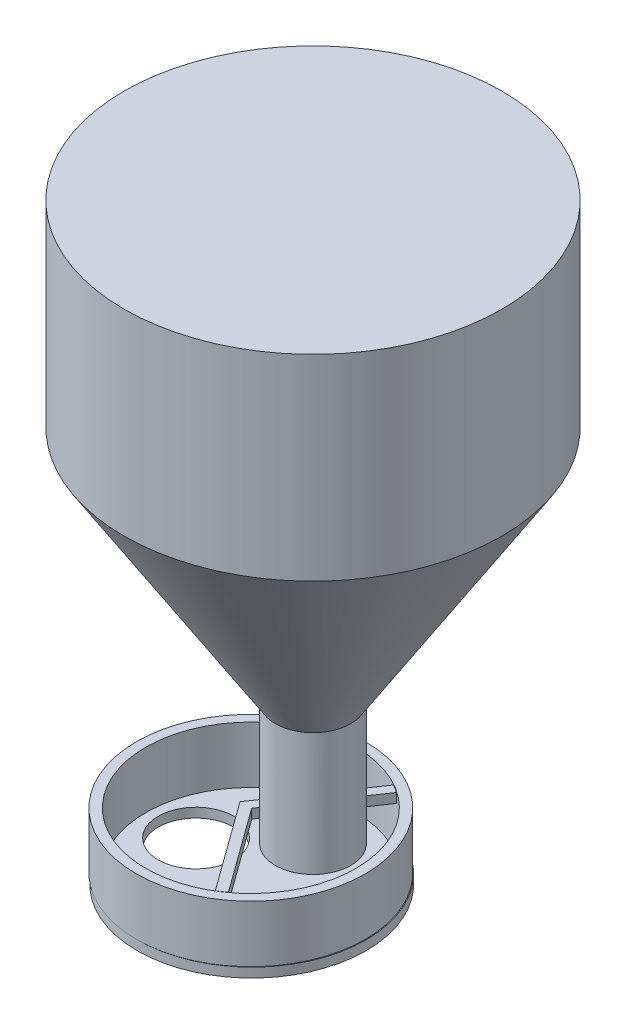
ISO-10303-21;
HEADER;
FILE_DESCRIPTION(('STEP AP214'),'2;1');
FILE_NAME('part.step','',(''),(''),'','','');
FILE_SCHEMA(('AUTOMOTIVE_DESIGN { 1 0 10303 214 1 1 1 1 }'));
ENDSEC;
DATA;
#1=APPLICATION_CONTEXT('core data for automotive mechanical design processes');
#2=APPLICATION_PROTOCOL_DEFINITION('international standard','automotive_design',2000,#1);
#3=PRODUCT_CONTEXT('',#1,'mechanical');
#4=PRODUCT('Part','Part','',(#3));
#5=PRODUCT_RELATED_PRODUCT_CATEGORY('part','',(#4));
#6=PRODUCT_DEFINITION_FORMATION('','',#4);
#7=PRODUCT_DEFINITION_CONTEXT('part definition',#1,'design');
#8=PRODUCT_DEFINITION('design','',#6,#7);
#9=PRODUCT_DEFINITION_SHAPE('','',#8);
#10=(LENGTH_UNIT() NAMED_UNIT(*) SI_UNIT(.MILLI.,.METRE.));
#11=(NAMED_UNIT(*) PLANE_ANGLE_UNIT() SI_UNIT($,.RADIAN.));
#12=(NAMED_UNIT(*) SI_UNIT($,.STERADIAN.) SOLID_ANGLE_UNIT());
#13=UNCERTAINTY_MEASURE_WITH_UNIT(LENGTH_MEASURE(1.E-05),#10,'distance_accuracy_value','');
#14=(GEOMETRIC_REPRESENTATION_CONTEXT(3) GLOBAL_UNCERTAINTY_ASSIGNED_CONTEXT((#13)) GLOBAL_UNIT_ASSIGNED_CONTEXT((#10,
#11,#12)) REPRESENTATION_CONTEXT('',''));
#15=CARTESIAN_POINT('',(0.,0.,0.));
#16=DIRECTION('',(0.,0.,1.));
#17=DIRECTION('',(1.,0.,0.));
#18=AXIS2_PLACEMENT_3D('',#15,#16,#17);
#19=CARTESIAN_POINT('',(-32.4436156280203,-300.,0.));
#20=DIRECTION('',(0.82602679065227,0.,0.563630855369639));
#21=DIRECTION('',(0.563630855369639,0.,-0.82602679065227));
#22=AXIS2_PLACEMENT_3D('',#19,#20,#21);
#23=PLANE('',#22);
#24=DIRECTION('',(0.563630855369639,0.,-0.82602679065227));
#25=VECTOR('',#24,1.);
#26=CARTESIAN_POINT('',(-32.4436156280203,-295.,0.));
#27=LINE('',#26,#25);
#28=CARTESIAN_POINT('',(-32.4436156280203,-295.,0.));
#29=VERTEX_POINT('',#28);
#30=CARTESIAN_POINT('',(-1.35770212525713,-295.,-45.5578276465039));
#31=VERTEX_POINT('',#30);
#32=EDGE_CURVE('E133',#29,#31,#27,.T.);
#33=ORIENTED_EDGE('',*,*,#32,.F.);
#34=DIRECTION('',(0.,1.,0.));
#35=VECTOR('',#34,1.);
#36=CARTESIAN_POINT('',(-32.4436156280203,-300.,0.));
#37=LINE('',#36,#35);
#38=CARTESIAN_POINT('',(-32.4436156280203,-300.,0.));
#39=VERTEX_POINT('',#38);
#40=EDGE_CURVE('E13',#39,#29,#37,.T.);
#41=ORIENTED_EDGE('',*,*,#40,.F.);
#42=DIRECTION('',(0.563630855369639,0.,-0.82602679065227));
#43=VECTOR('',#42,1.);
#44=CARTESIAN_POINT('',(-32.4436156280203,-300.,0.));
#45=LINE('',#44,#43);
#46=CARTESIAN_POINT('',(-1.35770212525713,-300.,-45.5578276465039));
#47=VERTEX_POINT('',#46);
#48=EDGE_CURVE('E147',#39,#47,#45,.T.);
#49=ORIENTED_EDGE('',*,*,#48,.T.);
#50=DIRECTION('',(0.,1.,0.));
#51=VECTOR('',#50,1.);
#52=CARTESIAN_POINT('',(-1.35770212525713,-300.,-45.5578276465039));
#53=LINE('',#52,#51);
#54=EDGE_CURVE('E51',#47,#31,#53,.T.);
#55=ORIENTED_EDGE('',*,*,#54,.T.);
#56=EDGE_LOOP('',(#33,#41,#49,#55));
#57=FACE_BOUND('',#56,.T.);
#58=ADVANCED_FACE('F48',(#57),#23,.T.);
#59=CARTESIAN_POINT('',(-0.108415749461369,-300.,44.6797999881767));
#60=DIRECTION('',(0.810106927783927,0.,-0.586282155243094));
#61=DIRECTION('',(-0.586282155243094,0.,-0.810106927783927));
#62=AXIS2_PLACEMENT_3D('',#59,#60,#61);
#63=PLANE('',#62);
#64=DIRECTION('',(-0.586282155243094,0.,-0.810106927783927));
#65=VECTOR('',#64,1.);
#66=CARTESIAN_POINT('',(-0.108415749461369,-295.,44.6797999881767));
#67=LINE('',#66,#65);
#68=CARTESIAN_POINT('',(-0.108415749461369,-295.,44.6797999881767));
#69=VERTEX_POINT('',#68);
#70=EDGE_CURVE('E145',#69,#29,#67,.T.);
#71=ORIENTED_EDGE('',*,*,#70,.F.);
#72=DIRECTION('',(0.,1.,0.));
#73=VECTOR('',#72,1.);
#74=CARTESIAN_POINT('',(-0.108415749461369,-300.,44.6797999881767));
#75=LINE('',#74,#73);
#76=CARTESIAN_POINT('',(-0.108415749461369,-300.,44.6797999881767));
#77=VERTEX_POINT('',#76);
#78=EDGE_CURVE('E57',#77,#69,#75,.T.);
#79=ORIENTED_EDGE('',*,*,#78,.F.);
#80=DIRECTION('',(-0.586282155243094,0.,-0.810106927783927));
#81=VECTOR('',#80,1.);
#82=CARTESIAN_POINT('',(-0.108415749461369,-300.,44.6797999881767));
#83=LINE('',#82,#81);
#84=EDGE_CURVE('E123',#77,#39,#83,.T.);
#85=ORIENTED_EDGE('',*,*,#84,.T.);
#86=ORIENTED_EDGE('',*,*,#40,.T.);
#87=EDGE_LOOP('',(#71,#79,#85,#86));
#88=FACE_BOUND('',#87,.T.);
#89=ADVANCED_FACE('F155',(#88),#63,.T.);
#90=CARTESIAN_POINT('',(-32.4436156280203,-300.,0.));
#91=DIRECTION('',(0.,1.,0.));
#92=DIRECTION('',(0.,0.,1.));
#93=AXIS2_PLACEMENT_3D('',#90,#91,#92);
#94=CYLINDRICAL_SURFACE('',#93,55.1529661774399);
#95=CARTESIAN_POINT('',(-32.4436156280203,-295.,0.));
#96=DIRECTION('',(0.,1.,0.));
#97=DIRECTION('',(0.,0.,1.));
#98=AXIS2_PLACEMENT_3D('',#95,#96,#97);
#99=CIRCLE('',#98,55.1529661774399);
#100=CARTESIAN_POINT('',(-4.29210092147986,-295.,47.427227389942));
#101=VERTEX_POINT('',#100);
#102=EDGE_CURVE('E110',#101,#69,#99,.T.);
#103=ORIENTED_EDGE('',*,*,#102,.F.);
#104=DIRECTION('',(0.,1.,0.));
#105=VECTOR('',#104,1.);
#106=CARTESIAN_POINT('',(-4.29210092147986,-300.,47.427227389942));
#107=LINE('',#106,#105);
#108=CARTESIAN_POINT('',(-4.29210092147986,-300.,47.427227389942));
#109=VERTEX_POINT('',#108);
#110=EDGE_CURVE('E105',#109,#101,#107,.T.);
#111=ORIENTED_EDGE('',*,*,#110,.F.);
#112=CARTESIAN_POINT('',(-32.4436156280203,-300.,0.));
#113=DIRECTION('',(0.,1.,0.));
#114=DIRECTION('',(0.,0.,1.));
#115=AXIS2_PLACEMENT_3D('',#112,#113,#114);
#116=CIRCLE('',#115,55.1529661774399);
#117=EDGE_CURVE('E108',#109,#77,#116,.T.);
#118=ORIENTED_EDGE('',*,*,#117,.T.);
#119=ORIENTED_EDGE('',*,*,#78,.T.);
#120=EDGE_LOOP('',(#103,#111,#118,#119));
#121=FACE_BOUND('',#120,.T.);
#122=ADVANCED_FACE('F107',(#121),#94,.T.);
#123=CARTESIAN_POINT('',(-4.29210092147986,-300.,47.427227389942));
#124=DIRECTION('',(-0.810106927783927,0.,0.586282155243094));
#125=DIRECTION('',(0.586282155243094,0.,0.810106927783927));
#126=AXIS2_PLACEMENT_3D('',#123,#124,#125);
#127=PLANE('',#126);
#128=DIRECTION('',(0.586282155243094,0.,0.810106927783926));
#129=VECTOR('',#128,1.);
#130=CARTESIAN_POINT('',(-4.29210092147986,-295.,47.427227389942));
#131=LINE('',#130,#129);
#132=CARTESIAN_POINT('',(-38.5544142618917,-295.,0.0846003787847013));
#133=VERTEX_POINT('',#132);
#134=EDGE_CURVE('E142',#133,#101,#131,.T.);
#135=ORIENTED_EDGE('',*,*,#134,.F.);
#136=DIRECTION('',(0.,1.,0.));
#137=VECTOR('',#136,1.);
#138=CARTESIAN_POINT('',(-38.5544142618917,-300.,0.0846003787847013));
#139=LINE('',#138,#137);
#140=CARTESIAN_POINT('',(-38.5544142618917,-300.,0.0846003787847013));
#141=VERTEX_POINT('',#140);
#142=EDGE_CURVE('E115',#141,#133,#139,.T.);
#143=ORIENTED_EDGE('',*,*,#142,.F.);
#144=DIRECTION('',(0.586282155243094,0.,0.810106927783926));
#145=VECTOR('',#144,1.);
#146=CARTESIAN_POINT('',(-4.29210092147986,-300.,47.427227389942));
#147=LINE('',#146,#145);
#148=EDGE_CURVE('E121',#141,#109,#147,.T.);
#149=ORIENTED_EDGE('',*,*,#148,.T.);
#150=ORIENTED_EDGE('',*,*,#110,.T.);
#151=EDGE_LOOP('',(#135,#143,#149,#150));
#152=FACE_BOUND('',#151,.T.);
#153=ADVANCED_FACE('F125',(#152),#127,.T.);
#154=CARTESIAN_POINT('',(-38.5544142618917,-300.,0.0846003787847013));
#155=DIRECTION('',(-0.82602679065227,0.,-0.563630855369639));
#156=DIRECTION('',(-0.563630855369639,0.,0.82602679065227));
#157=AXIS2_PLACEMENT_3D('',#154,#155,#156);
#158=PLANE('',#157);
#159=DIRECTION('',(-0.563630855369639,0.,0.82602679065227));
#160=VECTOR('',#159,1.);
#161=CARTESIAN_POINT('',(-38.5544142618917,-295.,0.0846003787847013));
#162=LINE('',#161,#160);
#163=CARTESIAN_POINT('',(-5.61584227518042,-295.,-48.1883829890409));
#164=VERTEX_POINT('',#163);
#165=EDGE_CURVE('E139',#164,#133,#162,.T.);
#166=ORIENTED_EDGE('',*,*,#165,.F.);
#167=DIRECTION('',(0.,1.,0.));
#168=VECTOR('',#167,1.);
#169=CARTESIAN_POINT('',(-5.61584227518042,-300.,-48.1883829890409));
#170=LINE('',#169,#168);
#171=CARTESIAN_POINT('',(-5.61584227518042,-300.,-48.1883829890409));
#172=VERTEX_POINT('',#171);
#173=EDGE_CURVE('E150',#172,#164,#170,.T.);
#174=ORIENTED_EDGE('',*,*,#173,.F.);
#175=DIRECTION('',(-0.563630855369639,0.,0.82602679065227));
#176=VECTOR('',#175,1.);
#177=CARTESIAN_POINT('',(-38.5544142618917,-300.,0.0846003787847013));
#178=LINE('',#177,#176);
#179=EDGE_CURVE('E126',#172,#141,#178,.T.);
#180=ORIENTED_EDGE('',*,*,#179,.T.);
#181=ORIENTED_EDGE('',*,*,#142,.T.);
#182=EDGE_LOOP('',(#166,#174,#180,#181));
#183=FACE_BOUND('',#182,.T.);
#184=ADVANCED_FACE('F168',(#183),#158,.T.);
#185=CARTESIAN_POINT('',(-32.4436156280203,-300.,0.));
#186=DIRECTION('',(0.,1.,0.));
#187=DIRECTION('',(0.,0.,1.));
#188=AXIS2_PLACEMENT_3D('',#185,#186,#187);
#189=CYLINDRICAL_SURFACE('',#188,55.1529661774399);
#190=CARTESIAN_POINT('',(-32.4436156280203,-295.,0.));
#191=DIRECTION('',(0.,1.,0.));
#192=DIRECTION('',(0.,0.,1.));
#193=AXIS2_PLACEMENT_3D('',#190,#191,#192);
#194=CIRCLE('',#193,55.1529661774399);
#195=EDGE_CURVE('E136',#31,#164,#194,.T.);
#196=ORIENTED_EDGE('',*,*,#195,.F.);
#197=ORIENTED_EDGE('',*,*,#54,.F.);
#198=CARTESIAN_POINT('',(-32.4436156280203,-300.,0.));
#199=DIRECTION('',(0.,1.,0.));
#200=DIRECTION('',(0.,0.,1.));
#201=AXIS2_PLACEMENT_3D('',#198,#199,#200);
#202=CIRCLE('',#201,55.1529661774399);
#203=EDGE_CURVE('E128',#47,#172,#202,.T.);
#204=ORIENTED_EDGE('',*,*,#203,.T.);
#205=ORIENTED_EDGE('',*,*,#173,.T.);
#206=EDGE_LOOP('',(#196,#197,#204,#205));
#207=FACE_BOUND('',#206,.T.);
#208=ADVANCED_FACE('F152',(#207),#189,.T.);
#209=CARTESIAN_POINT('',(-32.4436156280203,-300.,0.));
#210=DIRECTION('',(0.,1.,0.));
#211=DIRECTION('',(0.,0.,1.));
#212=AXIS2_PLACEMENT_3D('',#209,#210,#211);
#213=PLANE('',#212);
#214=ORIENTED_EDGE('',*,*,#48,.F.);
#215=ORIENTED_EDGE('',*,*,#84,.F.);
#216=ORIENTED_EDGE('',*,*,#117,.F.);
#217=ORIENTED_EDGE('',*,*,#148,.F.);
#218=ORIENTED_EDGE('',*,*,#179,.F.);
#219=ORIENTED_EDGE('',*,*,#203,.F.);
#220=EDGE_LOOP('',(#214,#215,#216,#217,#218,#219));
#221=FACE_BOUND('',#220,.T.);
#222=ADVANCED_FACE('F119',(#221),#213,.F.);
#223=CARTESIAN_POINT('',(-32.4436156280203,-295.,0.));
#224=DIRECTION('',(0.,1.,0.));
#225=DIRECTION('',(0.,0.,1.));
#226=AXIS2_PLACEMENT_3D('',#223,#224,#225);
#227=PLANE('',#226);
#228=ORIENTED_EDGE('',*,*,#32,.T.);
#229=ORIENTED_EDGE('',*,*,#195,.T.);
#230=ORIENTED_EDGE('',*,*,#165,.T.);
#231=ORIENTED_EDGE('',*,*,#134,.T.);
#232=ORIENTED_EDGE('',*,*,#102,.T.);
#233=ORIENTED_EDGE('',*,*,#70,.T.);
#234=EDGE_LOOP('',(#228,#229,#230,#231,#232,#233));
#235=FACE_BOUND('',#234,.T.);
#236=ADVANCED_FACE('F154',(#235),#227,.T.);
#237=CLOSED_SHELL('',(#58,#89,#122,#153,#184,#208,#222,#236));
#238=MANIFOLD_SOLID_BREP('B2',#237);
#239=CARTESIAN_POINT('',(-32.8934755645154,-325.,0.));
#240=DIRECTION('',(0.,-1.,0.));
#241=DIRECTION('',(0.,0.,-1.));
#242=AXIS2_PLACEMENT_3D('',#239,#240,#241);
#243=PLANE('',#242);
#244=CARTESIAN_POINT('',(-32.4436156280203,-325.,0.));
#245=DIRECTION('',(0.,-1.,0.));
#246=DIRECTION('',(0.,0.,-1.));
#247=AXIS2_PLACEMENT_3D('',#244,#245,#246);
#248=CIRCLE('',#247,60.6028261139354);
#249=CARTESIAN_POINT('',(-32.6685455962679,-325.,60.602408693923));
#250=VERTEX_POINT('',#249);
#251=CARTESIAN_POINT('',(-32.6685455962679,-325.,-60.602408693923));
#252=VERTEX_POINT('',#251);
#253=EDGE_CURVE('E245',#250,#252,#248,.T.);
#254=ORIENTED_EDGE('',*,*,#253,.F.);
#255=CARTESIAN_POINT('',(-32.8934755645154,-325.,0.));
#256=DIRECTION('',(0.,-1.,0.));
#257=DIRECTION('',(0.,0.,-1.));
#258=AXIS2_PLACEMENT_3D('',#255,#256,#257);
#259=CIRCLE('',#258,60.6028261139354);
#260=EDGE_CURVE('E239',#250,#252,#259,.T.);
#261=ORIENTED_EDGE('',*,*,#260,.T.);
#262=EDGE_LOOP('',(#254,#261));
#263=FACE_BOUND('',#262,.T.);
#264=ADVANCED_FACE('F230',(#263),#243,.T.);
#265=CARTESIAN_POINT('',(-32.8934755645154,-295.,0.));
#266=DIRECTION('',(0.,-1.,0.));
#267=DIRECTION('',(0.,0.,-1.));
#268=AXIS2_PLACEMENT_3D('',#265,#266,#267);
#269=PLANE('',#268);
#270=CARTESIAN_POINT('',(-32.8934755645154,-295.,0.));
#271=DIRECTION('',(0.,-1.,0.));
#272=DIRECTION('',(0.,0.,-1.));
#273=AXIS2_PLACEMENT_3D('',#270,#271,#272);
#274=CIRCLE('',#273,60.6028261139354);
#275=CARTESIAN_POINT('',(-32.8934755645154,-295.,-60.6028261139354));
#276=VERTEX_POINT('',#275);
#277=EDGE_CURVE('E234',#276,#276,#274,.T.);
#278=ORIENTED_EDGE('',*,*,#277,.F.);
#279=EDGE_LOOP('',(#278));
#280=FACE_BOUND('',#279,.T.);
#281=CARTESIAN_POINT('',(-32.8934755645154,-295.,0.));
#282=DIRECTION('',(0.,-1.,0.));
#283=DIRECTION('',(0.,0.,-1.));
#284=AXIS2_PLACEMENT_3D('',#281,#282,#283);
#285=CIRCLE('',#284,55.6028261139354);
#286=CARTESIAN_POINT('',(-32.8934755645154,-295.,-55.6028261139354));
#287=VERTEX_POINT('',#286);
#288=EDGE_CURVE('E267',#287,#287,#285,.T.);
#289=ORIENTED_EDGE('',*,*,#288,.T.);
#290=EDGE_LOOP('',(#289));
#291=FACE_BOUND('',#290,.T.);
#292=ADVANCED_FACE('F274',(#280,#291),#269,.F.);
#293=CARTESIAN_POINT('',(-32.8934755645154,-325.,0.));
#294=DIRECTION('',(0.,1.,0.));
#295=DIRECTION('',(0.,0.,1.));
#296=AXIS2_PLACEMENT_3D('',#293,#294,#295);
#297=CYLINDRICAL_SURFACE('',#296,60.6028261139354);
#298=EDGE_CURVE('E46',#252,#250,#259,.T.);
#299=ORIENTED_EDGE('',*,*,#298,.F.);
#300=ORIENTED_EDGE('',*,*,#260,.F.);
#301=EDGE_LOOP('',(#299,#300));
#302=FACE_BOUND('',#301,.T.);
#303=ORIENTED_EDGE('',*,*,#277,.T.);
#304=EDGE_LOOP('',(#303));
#305=FACE_BOUND('',#304,.T.);
#306=ADVANCED_FACE('F232',(#302,#305),#297,.T.);
#307=CARTESIAN_POINT('',(-32.8934755645154,-325.,0.));
#308=DIRECTION('',(0.,1.,0.));
#309=DIRECTION('',(0.,0.,1.));
#310=AXIS2_PLACEMENT_3D('',#307,#308,#309);
#311=CYLINDRICAL_SURFACE('',#310,55.6028261139354);
#312=CARTESIAN_POINT('',(-32.8934755645154,-325.,0.));
#313=DIRECTION('',(0.,-1.,0.));
#314=DIRECTION('',(0.,0.,-1.));
#315=AXIS2_PLACEMENT_3D('',#312,#313,#314);
#316=CIRCLE('',#315,55.6028261139354);
#317=CARTESIAN_POINT('',(-32.8934755645154,-325.,-55.6028261139354));
#318=VERTEX_POINT('',#317);
#319=EDGE_CURVE('E261',#318,#318,#316,.T.);
#320=ORIENTED_EDGE('',*,*,#319,.T.);
#321=EDGE_LOOP('',(#320));
#322=FACE_BOUND('',#321,.T.);
#323=ORIENTED_EDGE('',*,*,#288,.F.);
#324=EDGE_LOOP('',(#323));
#325=FACE_BOUND('',#324,.T.);
#326=ADVANCED_FACE('F280',(#322,#325),#311,.F.);
#327=CARTESIAN_POINT('',(-32.4436156280203,-325.,0.));
#328=DIRECTION('',(0.,-1.,0.));
#329=DIRECTION('',(0.,0.,-1.));
#330=AXIS2_PLACEMENT_3D('',#327,#328,#329);
#331=PLANE('',#330);
#332=EDGE_CURVE('E253',#252,#250,#248,.T.);
#333=ORIENTED_EDGE('',*,*,#332,.F.);
#334=ORIENTED_EDGE('',*,*,#298,.T.);
#335=EDGE_LOOP('',(#333,#334));
#336=FACE_BOUND('',#335,.T.);
#337=ADVANCED_FACE('F254',(#336),#331,.F.);
#338=CARTESIAN_POINT('',(-32.4436156280203,-330.,0.));
#339=DIRECTION('',(0.,-1.,0.));
#340=DIRECTION('',(0.,0.,-1.));
#341=AXIS2_PLACEMENT_3D('',#338,#339,#340);
#342=PLANE('',#341);
#343=CARTESIAN_POINT('',(-32.4436156280203,-330.,0.));
#344=DIRECTION('',(0.,-1.,0.));
#345=DIRECTION('',(0.,0.,-1.));
#346=AXIS2_PLACEMENT_3D('',#343,#344,#345);
#347=CIRCLE('',#346,60.6028261139354);
#348=CARTESIAN_POINT('',(-32.4436156280203,-330.,-60.6028261139354));
#349=VERTEX_POINT('',#348);
#350=EDGE_CURVE('E259',#349,#349,#347,.T.);
#351=ORIENTED_EDGE('',*,*,#350,.T.);
#352=EDGE_LOOP('',(#351));
#353=FACE_BOUND('',#352,.T.);
#354=CARTESIAN_POINT('',(-63.5377864199136,-330.,-1.61786030235778));
#355=DIRECTION('',(0.,-1.,0.));
#356=DIRECTION('',(0.,0.,-1.));
#357=AXIS2_PLACEMENT_3D('',#354,#355,#356);
#358=CIRCLE('',#357,20.);
#359=CARTESIAN_POINT('',(-63.5377864199136,-330.,-21.6178603023578));
#360=VERTEX_POINT('',#359);
#361=EDGE_CURVE('E256',#360,#360,#358,.T.);
#362=ORIENTED_EDGE('',*,*,#361,.F.);
#363=EDGE_LOOP('',(#362));
#364=FACE_BOUND('',#363,.T.);
#365=ADVANCED_FACE('F293',(#353,#364),#342,.T.);
#366=ORIENTED_EDGE('',*,*,#319,.F.);
#367=EDGE_LOOP('',(#366));
#368=FACE_BOUND('',#367,.T.);
#369=CARTESIAN_POINT('',(-63.5377864199136,-325.,-1.61786030235778));
#370=DIRECTION('',(0.,-1.,0.));
#371=DIRECTION('',(0.,0.,-1.));
#372=AXIS2_PLACEMENT_3D('',#369,#370,#371);
#373=CIRCLE('',#372,20.);
#374=CARTESIAN_POINT('',(-63.5377864199136,-325.,-21.6178603023578));
#375=VERTEX_POINT('',#374);
#376=EDGE_CURVE('E307',#375,#375,#373,.T.);
#377=ORIENTED_EDGE('',*,*,#376,.T.);
#378=EDGE_LOOP('',(#377));
#379=FACE_BOUND('',#378,.T.);
#380=ADVANCED_FACE('F289',(#368,#379),#331,.F.);
#381=CARTESIAN_POINT('',(-32.4436156280203,-330.,0.));
#382=DIRECTION('',(0.,1.,0.));
#383=DIRECTION('',(0.,0.,1.));
#384=AXIS2_PLACEMENT_3D('',#381,#382,#383);
#385=CYLINDRICAL_SURFACE('',#384,60.6028261139354);
#386=ORIENTED_EDGE('',*,*,#350,.F.);
#387=EDGE_LOOP('',(#386));
#388=FACE_BOUND('',#387,.T.);
#389=ORIENTED_EDGE('',*,*,#253,.T.);
#390=ORIENTED_EDGE('',*,*,#332,.T.);
#391=EDGE_LOOP('',(#389,#390));
#392=FACE_BOUND('',#391,.T.);
#393=ADVANCED_FACE('F258',(#388,#392),#385,.T.);
#394=CARTESIAN_POINT('',(-63.5377864199136,-330.,-1.61786030235778));
#395=DIRECTION('',(0.,1.,0.));
#396=DIRECTION('',(0.,0.,1.));
#397=AXIS2_PLACEMENT_3D('',#394,#395,#396);
#398=CYLINDRICAL_SURFACE('',#397,20.);
#399=ORIENTED_EDGE('',*,*,#361,.T.);
#400=EDGE_LOOP('',(#399));
#401=FACE_BOUND('',#400,.T.);
#402=ORIENTED_EDGE('',*,*,#376,.F.);
#403=EDGE_LOOP('',(#402));
#404=FACE_BOUND('',#403,.T.);
#405=ADVANCED_FACE('F288',(#401,#404),#398,.F.);
#406=CLOSED_SHELL('',(#264,#292,#306,#326,#337,#365,#380,#393,#405));
#407=MANIFOLD_SOLID_BREP('B7',#406);
#408=CARTESIAN_POINT('',(0.,-104.,0.));
#409=DIRECTION('',(0.,1.,0.));
#410=DIRECTION('',(0.,0.,1.));
#411=AXIS2_PLACEMENT_3D('',#408,#409,#410);
#412=CYLINDRICAL_SURFACE('',#411,100.);
#413=CARTESIAN_POINT('',(0.,-104.,0.));
#414=DIRECTION('',(0.,-1.,0.));
#415=DIRECTION('',(0.,0.,-1.));
#416=AXIS2_PLACEMENT_3D('',#413,#414,#415);
#417=CIRCLE('',#416,100.);
#418=CARTESIAN_POINT('',(0.,-104.,100.));
#419=VERTEX_POINT('',#418);
#420=EDGE_CURVE('E376',#419,#419,#417,.T.);
#421=CARTESIAN_POINT('',(0.,0.,0.));
#422=DIRECTION('',(0.,1.,0.));
#423=DIRECTION('',(0.,0.,1.));
#424=AXIS2_PLACEMENT_3D('',#421,#422,#423);
#425=CIRCLE('',#424,100.);
#426=CARTESIAN_POINT('',(0.,0.,100.));
#427=VERTEX_POINT('',#426);
#428=EDGE_CURVE('E229',#427,#427,#425,.T.);
#429=CARTESIAN_POINT('',(0.,-104.,100.));
#430=CARTESIAN_POINT('',(0.,-102.916666666667,100.));
#431=CARTESIAN_POINT('',(0.,-101.833333333333,100.));
#432=CARTESIAN_POINT('',(0.,-99.6666666666667,100.));
#433=CARTESIAN_POINT('',(0.,-98.5833333333333,100.));
#434=CARTESIAN_POINT('',(0.,-96.4166666666667,100.));
#435=CARTESIAN_POINT('',(0.,-95.3333333333333,100.));
#436=CARTESIAN_POINT('',(0.,-93.1666666666666,100.));
#437=CARTESIAN_POINT('',(0.,-92.0833333333333,100.));
#438=CARTESIAN_POINT('',(0.,-89.9166666666667,100.));
#439=CARTESIAN_POINT('',(0.,-88.8333333333333,100.));
#440=CARTESIAN_POINT('',(0.,-86.6666666666667,100.));
#441=CARTESIAN_POINT('',(0.,-85.5833333333333,100.));
#442=CARTESIAN_POINT('',(0.,-83.4166666666667,100.));
#443=CARTESIAN_POINT('',(0.,-82.3333333333333,100.));
#444=CARTESIAN_POINT('',(0.,-80.1666666666666,100.));
#445=CARTESIAN_POINT('',(0.,-79.0833333333333,100.));
#446=CARTESIAN_POINT('',(0.,-76.9166666666666,100.));
#447=CARTESIAN_POINT('',(0.,-75.8333333333333,100.));
#448=CARTESIAN_POINT('',(0.,-73.6666666666667,100.));
#449=CARTESIAN_POINT('',(0.,-72.5833333333333,100.));
#450=CARTESIAN_POINT('',(0.,-70.4166666666667,100.));
#451=CARTESIAN_POINT('',(0.,-69.3333333333333,100.));
#452=CARTESIAN_POINT('',(0.,-67.1666666666667,100.));
#453=CARTESIAN_POINT('',(0.,-66.0833333333333,100.));
#454=CARTESIAN_POINT('',(0.,-63.9166666666667,100.));
#455=CARTESIAN_POINT('',(0.,-62.8333333333333,100.));
#456=CARTESIAN_POINT('',(0.,-60.6666666666667,100.));
#457=CARTESIAN_POINT('',(0.,-59.5833333333333,100.));
#458=CARTESIAN_POINT('',(0.,-57.4166666666667,100.));
#459=CARTESIAN_POINT('',(0.,-56.3333333333333,100.));
#460=CARTESIAN_POINT('',(0.,-54.1666666666667,100.));
#461=CARTESIAN_POINT('',(0.,-53.0833333333333,100.));
#462=CARTESIAN_POINT('',(0.,-50.9166666666667,100.));
#463=CARTESIAN_POINT('',(0.,-49.8333333333333,100.));
#464=CARTESIAN_POINT('',(0.,-47.6666666666667,100.));
#465=CARTESIAN_POINT('',(0.,-46.5833333333333,100.));
#466=CARTESIAN_POINT('',(0.,-44.4166666666667,100.));
#467=CARTESIAN_POINT('',(0.,-43.3333333333333,100.));
#468=CARTESIAN_POINT('',(0.,-41.1666666666667,100.));
#469=CARTESIAN_POINT('',(0.,-40.0833333333333,100.));
#470=CARTESIAN_POINT('',(0.,-37.9166666666667,100.));
#471=CARTESIAN_POINT('',(0.,-36.8333333333333,100.));
#472=CARTESIAN_POINT('',(0.,-34.6666666666667,100.));
#473=CARTESIAN_POINT('',(0.,-33.5833333333333,100.));
#474=CARTESIAN_POINT('',(0.,-31.4166666666667,100.));
#475=CARTESIAN_POINT('',(0.,-30.3333333333333,100.));
#476=CARTESIAN_POINT('',(0.,-28.1666666666667,100.));
#477=CARTESIAN_POINT('',(0.,-27.0833333333333,100.));
#478=CARTESIAN_POINT('',(0.,-24.9166666666667,100.));
#479=CARTESIAN_POINT('',(0.,-23.8333333333333,100.));
#480=CARTESIAN_POINT('',(0.,-21.6666666666667,100.));
#481=CARTESIAN_POINT('',(0.,-20.5833333333333,100.));
#482=CARTESIAN_POINT('',(0.,-18.4166666666667,100.));
#483=CARTESIAN_POINT('',(0.,-17.3333333333333,100.));
#484=CARTESIAN_POINT('',(0.,-15.1666666666667,100.));
#485=CARTESIAN_POINT('',(0.,-14.0833333333333,100.));
#486=CARTESIAN_POINT('',(0.,-11.9166666666667,100.));
#487=CARTESIAN_POINT('',(0.,-10.8333333333333,100.));
#488=CARTESIAN_POINT('',(0.,-8.66666666666666,100.));
#489=CARTESIAN_POINT('',(0.,-7.58333333333333,100.));
#490=CARTESIAN_POINT('',(0.,-5.41666666666667,100.));
#491=CARTESIAN_POINT('',(0.,-4.33333333333334,100.));
#492=CARTESIAN_POINT('',(0.,-2.16666666666667,100.));
#493=CARTESIAN_POINT('',(0.,-1.08333333333333,100.));
#494=CARTESIAN_POINT('',(0.,0.,100.));
#495=B_SPLINE_CURVE_WITH_KNOTS('',3,(#429,#430,#431,#432,#433,#434,#435,#436,#437,#438,#439,
#440,#441,#442,#443,#444,#445,#446,#447,#448,#449,#450,#451,#452,#453,#454,#455,#456,#457,#458,
#459,#460,#461,#462,#463,#464,#465,#466,#467,#468,#469,#470,#471,#472,#473,#474,#475,#476,#477,
#478,#479,#480,#481,#482,#483,#484,#485,#486,#487,#488,#489,#490,#491,#492,#493,#494),
.UNSPECIFIED.,.F.,.F.,(4,2,2,2,2,2,2,2,2,2,2,2,2,2,2,2,2,2,2,2,2,2,2,2,2,2,2,2,2,2,2,2,4),(0.,
3.25,6.50000000000001,9.75000000000001,13.,16.25,19.5,22.75,26.,29.25,32.5,35.75,39.,42.25,45.5,
48.75,52.,55.25,58.5,61.75,65.,68.25,71.5,74.75,78.,81.25,84.5,87.75,91.,94.25,97.5,100.75,
104.),.UNSPECIFIED.);
#496=EDGE_CURVE('BSEAM367',#419,#427,#495,.T.);
#497=ORIENTED_EDGE('',*,*,#420,.F.);
#498=ORIENTED_EDGE('',*,*,#428,.F.);
#499=ORIENTED_EDGE('',*,*,#496,.T.);
#500=ORIENTED_EDGE('',*,*,#496,.F.);
#501=EDGE_LOOP('',(#497,#499,#498,#500));
#502=FACE_BOUND('',#501,.T.);
#503=ADVANCED_FACE('F367',(#502),#412,.T.);
#504=CARTESIAN_POINT('',(0.,0.,0.));
#505=DIRECTION('',(0.,1.,0.));
#506=DIRECTION('',(0.,0.,1.));
#507=AXIS2_PLACEMENT_3D('',#504,#505,#506);
#508=PLANE('',#507);
#509=ORIENTED_EDGE('',*,*,#428,.T.);
#510=EDGE_LOOP('',(#509));
#511=FACE_BOUND('',#510,.T.);
#512=ADVANCED_FACE('F412',(#511),#508,.T.);
#513=CARTESIAN_POINT('',(0.,-230.,0.));
#514=DIRECTION('',(0.,1.,0.));
#515=DIRECTION('',(0.,0.,1.));
#516=AXIS2_PLACEMENT_3D('',#513,#514,#515);
#517=CONICAL_SURFACE('',#516,20.,0.565701468656178);
#518=CARTESIAN_POINT('',(0.,-230.,0.));
#519=DIRECTION('',(0.,-1.,0.));
#520=DIRECTION('',(0.,0.,-1.));
#521=AXIS2_PLACEMENT_3D('',#518,#519,#520);
#522=CIRCLE('',#521,20.);
#523=CARTESIAN_POINT('',(0.,-230.,-20.));
#524=VERTEX_POINT('',#523);
#525=EDGE_CURVE('E387',#524,#524,#522,.T.);
#526=ORIENTED_EDGE('',*,*,#525,.F.);
#527=EDGE_LOOP('',(#526));
#528=FACE_BOUND('',#527,.T.);
#529=ORIENTED_EDGE('',*,*,#420,.T.);
#530=EDGE_LOOP('',(#529));
#531=FACE_BOUND('',#530,.T.);
#532=ADVANCED_FACE('F404',(#528,#531),#517,.T.);
#533=CARTESIAN_POINT('',(0.,-295.,0.));
#534=DIRECTION('',(0.,1.,0.));
#535=DIRECTION('',(0.,0.,1.));
#536=AXIS2_PLACEMENT_3D('',#533,#534,#535);
#537=CYLINDRICAL_SURFACE('',#536,20.);
#538=CARTESIAN_POINT('',(0.,-295.,0.));
#539=DIRECTION('',(0.,-1.,0.));
#540=DIRECTION('',(0.,0.,-1.));
#541=AXIS2_PLACEMENT_3D('',#538,#539,#540);
#542=CIRCLE('',#541,20.);
#543=CARTESIAN_POINT('',(0.,-295.,-20.));
#544=VERTEX_POINT('',#543);
#545=EDGE_CURVE('E381',#544,#544,#542,.T.);
#546=ORIENTED_EDGE('',*,*,#545,.F.);
#547=EDGE_LOOP('',(#546));
#548=FACE_BOUND('',#547,.T.);
#549=ORIENTED_EDGE('',*,*,#525,.T.);
#550=EDGE_LOOP('',(#549));
#551=FACE_BOUND('',#550,.T.);
#552=ADVANCED_FACE('F388',(#548,#551),#537,.T.);
#553=CARTESIAN_POINT('',(0.,-295.,0.));
#554=DIRECTION('',(0.,-1.,0.));
#555=DIRECTION('',(0.,0.,-1.));
#556=AXIS2_PLACEMENT_3D('',#553,#554,#555);
#557=PLANE('',#556);
#558=CARTESIAN_POINT('',(0.,-295.,0.));
#559=DIRECTION('',(0.,-1.,0.));
#560=DIRECTION('',(0.,0.,-1.));
#561=AXIS2_PLACEMENT_3D('',#558,#559,#560);
#562=CIRCLE('',#561,17.5);
#563=CARTESIAN_POINT('',(0.,-295.,-17.5));
#564=VERTEX_POINT('',#563);
#565=EDGE_CURVE('E395',#564,#564,#562,.T.);
#566=ORIENTED_EDGE('',*,*,#565,.F.);
#567=EDGE_LOOP('',(#566));
#568=FACE_BOUND('',#567,.T.);
#569=ORIENTED_EDGE('',*,*,#545,.T.);
#570=EDGE_LOOP('',(#569));
#571=FACE_BOUND('',#570,.T.);
#572=ADVANCED_FACE('F442',(#568,#571),#557,.T.);
#573=CARTESIAN_POINT('',(0.,-271.,0.));
#574=DIRECTION('',(0.,-1.,0.));
#575=DIRECTION('',(0.,0.,-1.));
#576=AXIS2_PLACEMENT_3D('',#573,#574,#575);
#577=CYLINDRICAL_SURFACE('',#576,17.5);
#578=CARTESIAN_POINT('',(0.,-271.,0.));
#579=DIRECTION('',(0.,-1.,0.));
#580=DIRECTION('',(0.,0.,-1.));
#581=AXIS2_PLACEMENT_3D('',#578,#579,#580);
#582=CIRCLE('',#581,17.5);
#583=CARTESIAN_POINT('',(0.,-271.,-17.5));
#584=VERTEX_POINT('',#583);
#585=EDGE_CURVE('E391',#584,#584,#582,.T.);
#586=ORIENTED_EDGE('',*,*,#585,.F.);
#587=EDGE_LOOP('',(#586));
#588=FACE_BOUND('',#587,.T.);
#589=ORIENTED_EDGE('',*,*,#565,.T.);
#590=EDGE_LOOP('',(#589));
#591=FACE_BOUND('',#590,.T.);
#592=ADVANCED_FACE('F451',(#588,#591),#577,.F.);
#593=CARTESIAN_POINT('',(0.,-271.,0.));
#594=DIRECTION('',(0.,-1.,0.));
#595=DIRECTION('',(0.,0.,-1.));
#596=AXIS2_PLACEMENT_3D('',#593,#594,#595);
#597=PLANE('',#596);
#598=ORIENTED_EDGE('',*,*,#585,.T.);
#599=EDGE_LOOP('',(#598));
#600=FACE_BOUND('',#599,.T.);
#601=ADVANCED_FACE('F460',(#600),#597,.T.);
#602=CLOSED_SHELL('',(#503,#512,#532,#552,#572,#592,#601));
#603=MANIFOLD_SOLID_BREP('B40',#602);
#604=ADVANCED_BREP_SHAPE_REPRESENTATION('',(#18,#238,#407,#603),#14);
#605=SHAPE_DEFINITION_REPRESENTATION(#9,#604);
ENDSEC;
END-ISO-10303-21;
